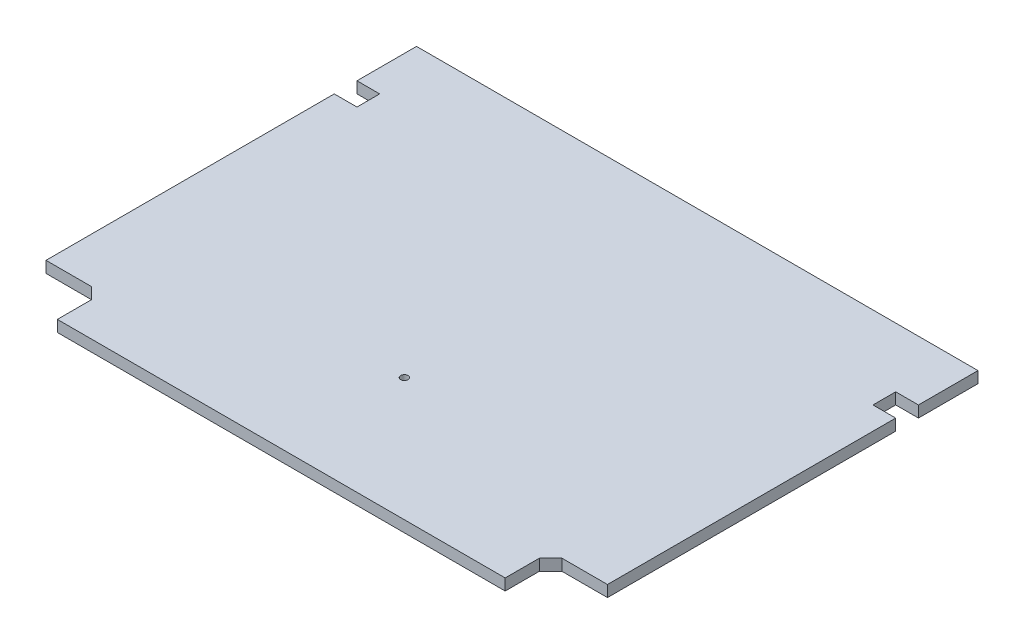
ISO-10303-21;
HEADER;
FILE_DESCRIPTION(('STEP AP214'),'2;1');
FILE_NAME('part.step','',(''),(''),'','','');
FILE_SCHEMA(('AUTOMOTIVE_DESIGN { 1 0 10303 214 1 1 1 1 }'));
ENDSEC;
DATA;
#1=APPLICATION_CONTEXT('core data for automotive mechanical design processes');
#2=APPLICATION_PROTOCOL_DEFINITION('international standard','automotive_design',2000,#1);
#3=PRODUCT_CONTEXT('',#1,'mechanical');
#4=PRODUCT('Part','Part','',(#3));
#5=PRODUCT_RELATED_PRODUCT_CATEGORY('part','',(#4));
#6=PRODUCT_DEFINITION_FORMATION('','',#4);
#7=PRODUCT_DEFINITION_CONTEXT('part definition',#1,'design');
#8=PRODUCT_DEFINITION('design','',#6,#7);
#9=PRODUCT_DEFINITION_SHAPE('','',#8);
#10=(LENGTH_UNIT() NAMED_UNIT(*) SI_UNIT(.MILLI.,.METRE.));
#11=(NAMED_UNIT(*) PLANE_ANGLE_UNIT() SI_UNIT($,.RADIAN.));
#12=(NAMED_UNIT(*) SI_UNIT($,.STERADIAN.) SOLID_ANGLE_UNIT());
#13=UNCERTAINTY_MEASURE_WITH_UNIT(LENGTH_MEASURE(1.E-05),#10,'distance_accuracy_value','');
#14=(GEOMETRIC_REPRESENTATION_CONTEXT(3) GLOBAL_UNCERTAINTY_ASSIGNED_CONTEXT((#13)) GLOBAL_UNIT_ASSIGNED_CONTEXT((#10,
#11,#12)) REPRESENTATION_CONTEXT('',''));
#15=CARTESIAN_POINT('',(0.,0.,0.));
#16=DIRECTION('',(0.,0.,1.));
#17=DIRECTION('',(1.,0.,0.));
#18=AXIS2_PLACEMENT_3D('',#15,#16,#17);
#19=CARTESIAN_POINT('',(0.,5.,0.));
#20=DIRECTION('',(0.,-1.,0.));
#21=DIRECTION('',(0.,0.,-1.));
#22=AXIS2_PLACEMENT_3D('',#19,#20,#21);
#23=PLANE('',#22);
#24=DIRECTION('',(0.,0.,-1.));
#25=VECTOR('',#24,1.);
#26=CARTESIAN_POINT('',(123.5,5.,21.2000000000035));
#27=LINE('',#26,#25);
#28=CARTESIAN_POINT('',(123.5,5.,21.2000000000035));
#29=VERTEX_POINT('',#28);
#30=CARTESIAN_POINT('',(123.5,5.,-4.99999999999998));
#31=VERTEX_POINT('',#30);
#32=EDGE_CURVE('E225',#29,#31,#27,.T.);
#33=ORIENTED_EDGE('',*,*,#32,.T.);
#34=DIRECTION('',(-1.,0.,0.));
#35=VECTOR('',#34,1.);
#36=CARTESIAN_POINT('',(-123.5,5.,-4.99999999999999));
#37=LINE('',#36,#35);
#38=CARTESIAN_POINT('',(-123.5,5.,-4.99999999999999));
#39=VERTEX_POINT('',#38);
#40=EDGE_CURVE('E123',#31,#39,#37,.T.);
#41=ORIENTED_EDGE('',*,*,#40,.T.);
#42=DIRECTION('',(0.,0.,1.));
#43=VECTOR('',#42,1.);
#44=CARTESIAN_POINT('',(-123.5,5.,21.2));
#45=LINE('',#44,#43);
#46=CARTESIAN_POINT('',(-123.5,5.,21.2));
#47=VERTEX_POINT('',#46);
#48=EDGE_CURVE('E270',#39,#47,#45,.T.);
#49=ORIENTED_EDGE('',*,*,#48,.T.);
#50=DIRECTION('',(1.,0.,0.));
#51=VECTOR('',#50,1.);
#52=CARTESIAN_POINT('',(-113.5,5.,21.2));
#53=LINE('',#52,#51);
#54=CARTESIAN_POINT('',(-113.5,5.,21.2));
#55=VERTEX_POINT('',#54);
#56=EDGE_CURVE('E289',#47,#55,#53,.T.);
#57=ORIENTED_EDGE('',*,*,#56,.T.);
#58=DIRECTION('',(0.,0.,1.));
#59=VECTOR('',#58,1.);
#60=CARTESIAN_POINT('',(-113.5,5.,31.2));
#61=LINE('',#60,#59);
#62=CARTESIAN_POINT('',(-113.5,5.,31.2));
#63=VERTEX_POINT('',#62);
#64=EDGE_CURVE('E286',#55,#63,#61,.T.);
#65=ORIENTED_EDGE('',*,*,#64,.T.);
#66=DIRECTION('',(-1.,0.,0.));
#67=VECTOR('',#66,1.);
#68=CARTESIAN_POINT('',(-123.5,5.,31.2));
#69=LINE('',#68,#67);
#70=CARTESIAN_POINT('',(-123.5,5.,31.2));
#71=VERTEX_POINT('',#70);
#72=EDGE_CURVE('E288',#63,#71,#69,.T.);
#73=ORIENTED_EDGE('',*,*,#72,.T.);
#74=DIRECTION('',(0.,0.,1.));
#75=VECTOR('',#74,1.);
#76=CARTESIAN_POINT('',(-123.5,5.,31.2));
#77=LINE('',#76,#75);
#78=CARTESIAN_POINT('',(-123.5,5.,158.));
#79=VERTEX_POINT('',#78);
#80=EDGE_CURVE('E291',#71,#79,#77,.T.);
#81=ORIENTED_EDGE('',*,*,#80,.T.);
#82=DIRECTION('',(1.,0.,0.));
#83=VECTOR('',#82,1.);
#84=CARTESIAN_POINT('',(-123.5,5.,158.));
#85=LINE('',#84,#83);
#86=CARTESIAN_POINT('',(-103.5,5.,158.));
#87=VERTEX_POINT('',#86);
#88=EDGE_CURVE('E297',#79,#87,#85,.T.);
#89=ORIENTED_EDGE('',*,*,#88,.T.);
#90=DIRECTION('',(0.707106781186547,0.,0.707106781186547));
#91=VECTOR('',#90,1.);
#92=CARTESIAN_POINT('',(-103.5,5.,158.));
#93=LINE('',#92,#91);
#94=CARTESIAN_POINT('',(-98.5,5.,163.));
#95=VERTEX_POINT('',#94);
#96=EDGE_CURVE('E299',#87,#95,#93,.T.);
#97=ORIENTED_EDGE('',*,*,#96,.T.);
#98=DIRECTION('',(0.,0.,1.));
#99=VECTOR('',#98,1.);
#100=CARTESIAN_POINT('',(-98.5,5.,163.));
#101=LINE('',#100,#99);
#102=CARTESIAN_POINT('',(-98.5,5.,178.));
#103=VERTEX_POINT('',#102);
#104=EDGE_CURVE('E301',#95,#103,#101,.T.);
#105=ORIENTED_EDGE('',*,*,#104,.T.);
#106=DIRECTION('',(1.,0.,0.));
#107=VECTOR('',#106,1.);
#108=CARTESIAN_POINT('',(-98.5,5.,178.));
#109=LINE('',#108,#107);
#110=CARTESIAN_POINT('',(98.5,5.,178.));
#111=VERTEX_POINT('',#110);
#112=EDGE_CURVE('E303',#103,#111,#109,.T.);
#113=ORIENTED_EDGE('',*,*,#112,.T.);
#114=DIRECTION('',(0.,0.,-1.));
#115=VECTOR('',#114,1.);
#116=CARTESIAN_POINT('',(98.5,5.,178.));
#117=LINE('',#116,#115);
#118=CARTESIAN_POINT('',(98.5,5.,163.));
#119=VERTEX_POINT('',#118);
#120=EDGE_CURVE('E305',#111,#119,#117,.T.);
#121=ORIENTED_EDGE('',*,*,#120,.T.);
#122=DIRECTION('',(0.707106781186547,0.,-0.707106781186547));
#123=VECTOR('',#122,1.);
#124=CARTESIAN_POINT('',(98.5,5.,163.));
#125=LINE('',#124,#123);
#126=CARTESIAN_POINT('',(103.5,5.,158.));
#127=VERTEX_POINT('',#126);
#128=EDGE_CURVE('E307',#119,#127,#125,.T.);
#129=ORIENTED_EDGE('',*,*,#128,.T.);
#130=DIRECTION('',(1.,0.,0.));
#131=VECTOR('',#130,1.);
#132=CARTESIAN_POINT('',(103.5,5.,158.));
#133=LINE('',#132,#131);
#134=CARTESIAN_POINT('',(123.5,5.,158.));
#135=VERTEX_POINT('',#134);
#136=EDGE_CURVE('E309',#127,#135,#133,.T.);
#137=ORIENTED_EDGE('',*,*,#136,.T.);
#138=DIRECTION('',(0.,0.,-1.));
#139=VECTOR('',#138,1.);
#140=CARTESIAN_POINT('',(123.5,5.,31.2000000000035));
#141=LINE('',#140,#139);
#142=CARTESIAN_POINT('',(123.5,5.,31.2000000000035));
#143=VERTEX_POINT('',#142);
#144=EDGE_CURVE('E172',#135,#143,#141,.T.);
#145=ORIENTED_EDGE('',*,*,#144,.T.);
#146=DIRECTION('',(-1.,0.,0.));
#147=VECTOR('',#146,1.);
#148=CARTESIAN_POINT('',(123.5,5.,31.2000000000035));
#149=LINE('',#148,#147);
#150=CARTESIAN_POINT('',(113.5,5.,31.2000000000035));
#151=VERTEX_POINT('',#150);
#152=EDGE_CURVE('E166',#143,#151,#149,.T.);
#153=ORIENTED_EDGE('',*,*,#152,.T.);
#154=DIRECTION('',(0.,0.,-1.));
#155=VECTOR('',#154,1.);
#156=CARTESIAN_POINT('',(113.5,5.,31.2000000000035));
#157=LINE('',#156,#155);
#158=CARTESIAN_POINT('',(113.5,5.,21.2000000000035));
#159=VERTEX_POINT('',#158);
#160=EDGE_CURVE('E170',#151,#159,#157,.T.);
#161=ORIENTED_EDGE('',*,*,#160,.T.);
#162=DIRECTION('',(1.,0.,0.));
#163=VECTOR('',#162,1.);
#164=CARTESIAN_POINT('',(113.5,5.,21.2000000000035));
#165=LINE('',#164,#163);
#166=EDGE_CURVE('E50',#159,#29,#165,.T.);
#167=ORIENTED_EDGE('',*,*,#166,.T.);
#168=EDGE_LOOP('',(#33,#41,#49,#57,#65,#73,#81,#89,#97,#105,#113,#121,#129,#137,#145,#153,#161,#167));
#169=FACE_BOUND('',#168,.T.);
#170=CARTESIAN_POINT('',(0.,5.,123.86));
#171=DIRECTION('',(0.,1.,0.));
#172=DIRECTION('',(0.,0.,1.));
#173=AXIS2_PLACEMENT_3D('',#170,#171,#172);
#174=CIRCLE('',#173,1.6);
#175=CARTESIAN_POINT('',(0.,5.,125.46));
#176=VERTEX_POINT('',#175);
#177=EDGE_CURVE('E194',#176,#176,#174,.T.);
#178=ORIENTED_EDGE('',*,*,#177,.F.);
#179=EDGE_LOOP('',(#178));
#180=FACE_BOUND('',#179,.T.);
#181=ADVANCED_FACE('F33',(#169,#180),#23,.F.);
#182=CARTESIAN_POINT('',(0.,0.,0.));
#183=DIRECTION('',(0.,-1.,0.));
#184=DIRECTION('',(0.,0.,-1.));
#185=AXIS2_PLACEMENT_3D('',#182,#183,#184);
#186=PLANE('',#185);
#187=DIRECTION('',(0.,0.,-1.));
#188=VECTOR('',#187,1.);
#189=CARTESIAN_POINT('',(123.5,0.,21.2000000000035));
#190=LINE('',#189,#188);
#191=CARTESIAN_POINT('',(123.5,0.,21.2000000000035));
#192=VERTEX_POINT('',#191);
#193=CARTESIAN_POINT('',(123.5,0.,-4.99999999999998));
#194=VERTEX_POINT('',#193);
#195=EDGE_CURVE('E190',#192,#194,#190,.T.);
#196=ORIENTED_EDGE('',*,*,#195,.F.);
#197=DIRECTION('',(1.,0.,0.));
#198=VECTOR('',#197,1.);
#199=CARTESIAN_POINT('',(113.5,0.,21.2000000000035));
#200=LINE('',#199,#198);
#201=CARTESIAN_POINT('',(113.5,0.,21.2000000000035));
#202=VERTEX_POINT('',#201);
#203=EDGE_CURVE('E115',#202,#192,#200,.T.);
#204=ORIENTED_EDGE('',*,*,#203,.F.);
#205=DIRECTION('',(0.,0.,-1.));
#206=VECTOR('',#205,1.);
#207=CARTESIAN_POINT('',(113.5,0.,31.2000000000035));
#208=LINE('',#207,#206);
#209=CARTESIAN_POINT('',(113.5,0.,31.2000000000035));
#210=VERTEX_POINT('',#209);
#211=EDGE_CURVE('E109',#210,#202,#208,.T.);
#212=ORIENTED_EDGE('',*,*,#211,.F.);
#213=DIRECTION('',(-1.,0.,0.));
#214=VECTOR('',#213,1.);
#215=CARTESIAN_POINT('',(123.5,0.,31.2000000000035));
#216=LINE('',#215,#214);
#217=CARTESIAN_POINT('',(123.5,0.,31.2000000000035));
#218=VERTEX_POINT('',#217);
#219=EDGE_CURVE('E180',#218,#210,#216,.T.);
#220=ORIENTED_EDGE('',*,*,#219,.F.);
#221=DIRECTION('',(0.,0.,-1.));
#222=VECTOR('',#221,1.);
#223=CARTESIAN_POINT('',(123.5,0.,31.2000000000035));
#224=LINE('',#223,#222);
#225=CARTESIAN_POINT('',(123.5,0.,158.));
#226=VERTEX_POINT('',#225);
#227=EDGE_CURVE('E220',#226,#218,#224,.T.);
#228=ORIENTED_EDGE('',*,*,#227,.F.);
#229=DIRECTION('',(1.,0.,0.));
#230=VECTOR('',#229,1.);
#231=CARTESIAN_POINT('',(103.5,0.,158.));
#232=LINE('',#231,#230);
#233=CARTESIAN_POINT('',(103.5,0.,158.));
#234=VERTEX_POINT('',#233);
#235=EDGE_CURVE('E218',#234,#226,#232,.T.);
#236=ORIENTED_EDGE('',*,*,#235,.F.);
#237=DIRECTION('',(0.707106781186547,0.,-0.707106781186547));
#238=VECTOR('',#237,1.);
#239=CARTESIAN_POINT('',(98.5,0.,163.));
#240=LINE('',#239,#238);
#241=CARTESIAN_POINT('',(98.5,0.,163.));
#242=VERTEX_POINT('',#241);
#243=EDGE_CURVE('E216',#242,#234,#240,.T.);
#244=ORIENTED_EDGE('',*,*,#243,.F.);
#245=DIRECTION('',(0.,0.,-1.));
#246=VECTOR('',#245,1.);
#247=CARTESIAN_POINT('',(98.5,0.,178.));
#248=LINE('',#247,#246);
#249=CARTESIAN_POINT('',(98.5,0.,178.));
#250=VERTEX_POINT('',#249);
#251=EDGE_CURVE('E214',#250,#242,#248,.T.);
#252=ORIENTED_EDGE('',*,*,#251,.F.);
#253=DIRECTION('',(1.,0.,0.));
#254=VECTOR('',#253,1.);
#255=CARTESIAN_POINT('',(-98.5,0.,178.));
#256=LINE('',#255,#254);
#257=CARTESIAN_POINT('',(-98.5,0.,178.));
#258=VERTEX_POINT('',#257);
#259=EDGE_CURVE('E212',#258,#250,#256,.T.);
#260=ORIENTED_EDGE('',*,*,#259,.F.);
#261=DIRECTION('',(0.,0.,1.));
#262=VECTOR('',#261,1.);
#263=CARTESIAN_POINT('',(-98.5,0.,163.));
#264=LINE('',#263,#262);
#265=CARTESIAN_POINT('',(-98.5,0.,163.));
#266=VERTEX_POINT('',#265);
#267=EDGE_CURVE('E210',#266,#258,#264,.T.);
#268=ORIENTED_EDGE('',*,*,#267,.F.);
#269=DIRECTION('',(0.707106781186547,0.,0.707106781186547));
#270=VECTOR('',#269,1.);
#271=CARTESIAN_POINT('',(-103.5,0.,158.));
#272=LINE('',#271,#270);
#273=CARTESIAN_POINT('',(-103.5,0.,158.));
#274=VERTEX_POINT('',#273);
#275=EDGE_CURVE('E208',#274,#266,#272,.T.);
#276=ORIENTED_EDGE('',*,*,#275,.F.);
#277=DIRECTION('',(1.,0.,0.));
#278=VECTOR('',#277,1.);
#279=CARTESIAN_POINT('',(-123.5,0.,158.));
#280=LINE('',#279,#278);
#281=CARTESIAN_POINT('',(-123.5,0.,158.));
#282=VERTEX_POINT('',#281);
#283=EDGE_CURVE('E206',#282,#274,#280,.T.);
#284=ORIENTED_EDGE('',*,*,#283,.F.);
#285=DIRECTION('',(0.,0.,1.));
#286=VECTOR('',#285,1.);
#287=CARTESIAN_POINT('',(-123.5,0.,31.2));
#288=LINE('',#287,#286);
#289=CARTESIAN_POINT('',(-123.5,0.,31.2));
#290=VERTEX_POINT('',#289);
#291=EDGE_CURVE('E204',#290,#282,#288,.T.);
#292=ORIENTED_EDGE('',*,*,#291,.F.);
#293=DIRECTION('',(-1.,0.,0.));
#294=VECTOR('',#293,1.);
#295=CARTESIAN_POINT('',(-123.5,0.,31.2));
#296=LINE('',#295,#294);
#297=CARTESIAN_POINT('',(-113.5,0.,31.2));
#298=VERTEX_POINT('',#297);
#299=EDGE_CURVE('E202',#298,#290,#296,.T.);
#300=ORIENTED_EDGE('',*,*,#299,.F.);
#301=DIRECTION('',(0.,0.,1.));
#302=VECTOR('',#301,1.);
#303=CARTESIAN_POINT('',(-113.5,0.,31.2));
#304=LINE('',#303,#302);
#305=CARTESIAN_POINT('',(-113.5,0.,21.2));
#306=VERTEX_POINT('',#305);
#307=EDGE_CURVE('E200',#306,#298,#304,.T.);
#308=ORIENTED_EDGE('',*,*,#307,.F.);
#309=DIRECTION('',(1.,0.,0.));
#310=VECTOR('',#309,1.);
#311=CARTESIAN_POINT('',(-113.5,0.,21.2));
#312=LINE('',#311,#310);
#313=CARTESIAN_POINT('',(-123.5,0.,21.2));
#314=VERTEX_POINT('',#313);
#315=EDGE_CURVE('E198',#314,#306,#312,.T.);
#316=ORIENTED_EDGE('',*,*,#315,.F.);
#317=DIRECTION('',(0.,0.,1.));
#318=VECTOR('',#317,1.);
#319=CARTESIAN_POINT('',(-123.5,0.,21.2));
#320=LINE('',#319,#318);
#321=CARTESIAN_POINT('',(-123.5,0.,-4.99999999999999));
#322=VERTEX_POINT('',#321);
#323=EDGE_CURVE('E196',#322,#314,#320,.T.);
#324=ORIENTED_EDGE('',*,*,#323,.F.);
#325=DIRECTION('',(-1.,0.,0.));
#326=VECTOR('',#325,1.);
#327=CARTESIAN_POINT('',(-123.5,0.,-4.99999999999999));
#328=LINE('',#327,#326);
#329=EDGE_CURVE('E193',#194,#322,#328,.T.);
#330=ORIENTED_EDGE('',*,*,#329,.F.);
#331=EDGE_LOOP('',(#196,#204,#212,#220,#228,#236,#244,#252,#260,#268,#276,#284,#292,#300,#308,
#316,#324,#330));
#332=FACE_BOUND('',#331,.T.);
#333=CARTESIAN_POINT('',(0.,0.,123.86));
#334=DIRECTION('',(0.,1.,0.));
#335=DIRECTION('',(0.,0.,1.));
#336=AXIS2_PLACEMENT_3D('',#333,#334,#335);
#337=CIRCLE('',#336,1.6);
#338=CARTESIAN_POINT('',(0.,0.,125.46));
#339=VERTEX_POINT('',#338);
#340=EDGE_CURVE('E534',#339,#339,#337,.T.);
#341=ORIENTED_EDGE('',*,*,#340,.T.);
#342=EDGE_LOOP('',(#341));
#343=FACE_BOUND('',#342,.T.);
#344=ADVANCED_FACE('F274',(#332,#343),#186,.T.);
#345=CARTESIAN_POINT('',(123.5,5.,21.2000000000035));
#346=DIRECTION('',(-1.,0.,0.));
#347=DIRECTION('',(0.,0.,1.));
#348=AXIS2_PLACEMENT_3D('',#345,#346,#347);
#349=PLANE('',#348);
#350=ORIENTED_EDGE('',*,*,#195,.T.);
#351=DIRECTION('',(0.,-1.,0.));
#352=VECTOR('',#351,1.);
#353=CARTESIAN_POINT('',(123.5,5.,-4.99999999999998));
#354=LINE('',#353,#352);
#355=EDGE_CURVE('E11',#31,#194,#354,.T.);
#356=ORIENTED_EDGE('',*,*,#355,.F.);
#357=ORIENTED_EDGE('',*,*,#32,.F.);
#358=DIRECTION('',(0.,-1.,0.));
#359=VECTOR('',#358,1.);
#360=CARTESIAN_POINT('',(123.5,5.,21.2000000000035));
#361=LINE('',#360,#359);
#362=EDGE_CURVE('E186',#29,#192,#361,.T.);
#363=ORIENTED_EDGE('',*,*,#362,.T.);
#364=EDGE_LOOP('',(#350,#356,#357,#363));
#365=FACE_BOUND('',#364,.T.);
#366=ADVANCED_FACE('F35',(#365),#349,.F.);
#367=CARTESIAN_POINT('',(-123.5,5.,-4.99999999999999));
#368=DIRECTION('',(0.,0.,1.));
#369=DIRECTION('',(1.,0.,0.));
#370=AXIS2_PLACEMENT_3D('',#367,#368,#369);
#371=PLANE('',#370);
#372=ORIENTED_EDGE('',*,*,#329,.T.);
#373=DIRECTION('',(0.,-1.,0.));
#374=VECTOR('',#373,1.);
#375=CARTESIAN_POINT('',(-123.5,5.,-4.99999999999999));
#376=LINE('',#375,#374);
#377=EDGE_CURVE('E42',#39,#322,#376,.T.);
#378=ORIENTED_EDGE('',*,*,#377,.F.);
#379=ORIENTED_EDGE('',*,*,#40,.F.);
#380=ORIENTED_EDGE('',*,*,#355,.T.);
#381=EDGE_LOOP('',(#372,#378,#379,#380));
#382=FACE_BOUND('',#381,.T.);
#383=ADVANCED_FACE('F343',(#382),#371,.F.);
#384=CARTESIAN_POINT('',(-123.5,5.,21.2));
#385=DIRECTION('',(1.,0.,0.));
#386=DIRECTION('',(0.,0.,-1.));
#387=AXIS2_PLACEMENT_3D('',#384,#385,#386);
#388=PLANE('',#387);
#389=ORIENTED_EDGE('',*,*,#323,.T.);
#390=DIRECTION('',(0.,-1.,0.));
#391=VECTOR('',#390,1.);
#392=CARTESIAN_POINT('',(-123.5,5.,21.2));
#393=LINE('',#392,#391);
#394=EDGE_CURVE('E262',#47,#314,#393,.T.);
#395=ORIENTED_EDGE('',*,*,#394,.F.);
#396=ORIENTED_EDGE('',*,*,#48,.F.);
#397=ORIENTED_EDGE('',*,*,#377,.T.);
#398=EDGE_LOOP('',(#389,#395,#396,#397));
#399=FACE_BOUND('',#398,.T.);
#400=ADVANCED_FACE('F268',(#399),#388,.F.);
#401=CARTESIAN_POINT('',(-113.5,5.,21.2));
#402=DIRECTION('',(0.,0.,-1.));
#403=DIRECTION('',(-1.,0.,0.));
#404=AXIS2_PLACEMENT_3D('',#401,#402,#403);
#405=PLANE('',#404);
#406=ORIENTED_EDGE('',*,*,#315,.T.);
#407=DIRECTION('',(0.,-1.,0.));
#408=VECTOR('',#407,1.);
#409=CARTESIAN_POINT('',(-113.5,5.,21.2));
#410=LINE('',#409,#408);
#411=EDGE_CURVE('E259',#55,#306,#410,.T.);
#412=ORIENTED_EDGE('',*,*,#411,.F.);
#413=ORIENTED_EDGE('',*,*,#56,.F.);
#414=ORIENTED_EDGE('',*,*,#394,.T.);
#415=EDGE_LOOP('',(#406,#412,#413,#414));
#416=FACE_BOUND('',#415,.T.);
#417=ADVANCED_FACE('F280',(#416),#405,.F.);
#418=CARTESIAN_POINT('',(-113.5,5.,31.2));
#419=DIRECTION('',(1.,0.,0.));
#420=DIRECTION('',(0.,0.,-1.));
#421=AXIS2_PLACEMENT_3D('',#418,#419,#420);
#422=PLANE('',#421);
#423=ORIENTED_EDGE('',*,*,#307,.T.);
#424=DIRECTION('',(0.,-1.,0.));
#425=VECTOR('',#424,1.);
#426=CARTESIAN_POINT('',(-113.5,5.,31.2));
#427=LINE('',#426,#425);
#428=EDGE_CURVE('E256',#63,#298,#427,.T.);
#429=ORIENTED_EDGE('',*,*,#428,.F.);
#430=ORIENTED_EDGE('',*,*,#64,.F.);
#431=ORIENTED_EDGE('',*,*,#411,.T.);
#432=EDGE_LOOP('',(#423,#429,#430,#431));
#433=FACE_BOUND('',#432,.T.);
#434=ADVANCED_FACE('F284',(#433),#422,.F.);
#435=CARTESIAN_POINT('',(-123.5,5.,31.2));
#436=DIRECTION('',(0.,0.,1.));
#437=DIRECTION('',(1.,0.,0.));
#438=AXIS2_PLACEMENT_3D('',#435,#436,#437);
#439=PLANE('',#438);
#440=ORIENTED_EDGE('',*,*,#299,.T.);
#441=DIRECTION('',(0.,-1.,0.));
#442=VECTOR('',#441,1.);
#443=CARTESIAN_POINT('',(-123.5,5.,31.2));
#444=LINE('',#443,#442);
#445=EDGE_CURVE('E253',#71,#290,#444,.T.);
#446=ORIENTED_EDGE('',*,*,#445,.F.);
#447=ORIENTED_EDGE('',*,*,#72,.F.);
#448=ORIENTED_EDGE('',*,*,#428,.T.);
#449=EDGE_LOOP('',(#440,#446,#447,#448));
#450=FACE_BOUND('',#449,.T.);
#451=ADVANCED_FACE('F356',(#450),#439,.F.);
#452=CARTESIAN_POINT('',(-123.5,5.,31.2));
#453=DIRECTION('',(1.,0.,0.));
#454=DIRECTION('',(0.,0.,-1.));
#455=AXIS2_PLACEMENT_3D('',#452,#453,#454);
#456=PLANE('',#455);
#457=ORIENTED_EDGE('',*,*,#291,.T.);
#458=DIRECTION('',(0.,-1.,0.));
#459=VECTOR('',#458,1.);
#460=CARTESIAN_POINT('',(-123.5,5.,158.));
#461=LINE('',#460,#459);
#462=EDGE_CURVE('E250',#79,#282,#461,.T.);
#463=ORIENTED_EDGE('',*,*,#462,.F.);
#464=ORIENTED_EDGE('',*,*,#80,.F.);
#465=ORIENTED_EDGE('',*,*,#445,.T.);
#466=EDGE_LOOP('',(#457,#463,#464,#465));
#467=FACE_BOUND('',#466,.T.);
#468=ADVANCED_FACE('F359',(#467),#456,.F.);
#469=CARTESIAN_POINT('',(-123.5,5.,158.));
#470=DIRECTION('',(0.,0.,-1.));
#471=DIRECTION('',(-1.,0.,0.));
#472=AXIS2_PLACEMENT_3D('',#469,#470,#471);
#473=PLANE('',#472);
#474=ORIENTED_EDGE('',*,*,#283,.T.);
#475=DIRECTION('',(0.,-1.,0.));
#476=VECTOR('',#475,1.);
#477=CARTESIAN_POINT('',(-103.5,5.,158.));
#478=LINE('',#477,#476);
#479=EDGE_CURVE('E247',#87,#274,#478,.T.);
#480=ORIENTED_EDGE('',*,*,#479,.F.);
#481=ORIENTED_EDGE('',*,*,#88,.F.);
#482=ORIENTED_EDGE('',*,*,#462,.T.);
#483=EDGE_LOOP('',(#474,#480,#481,#482));
#484=FACE_BOUND('',#483,.T.);
#485=ADVANCED_FACE('F363',(#484),#473,.F.);
#486=CARTESIAN_POINT('',(-103.5,5.,158.));
#487=DIRECTION('',(0.707106781186548,0.,-0.707106781186548));
#488=DIRECTION('',(-0.707106781186548,0.,-0.707106781186548));
#489=AXIS2_PLACEMENT_3D('',#486,#487,#488);
#490=PLANE('',#489);
#491=ORIENTED_EDGE('',*,*,#275,.T.);
#492=DIRECTION('',(0.,-1.,0.));
#493=VECTOR('',#492,1.);
#494=CARTESIAN_POINT('',(-98.5,5.,163.));
#495=LINE('',#494,#493);
#496=EDGE_CURVE('E244',#95,#266,#495,.T.);
#497=ORIENTED_EDGE('',*,*,#496,.F.);
#498=ORIENTED_EDGE('',*,*,#96,.F.);
#499=ORIENTED_EDGE('',*,*,#479,.T.);
#500=EDGE_LOOP('',(#491,#497,#498,#499));
#501=FACE_BOUND('',#500,.T.);
#502=ADVANCED_FACE('F367',(#501),#490,.F.);
#503=CARTESIAN_POINT('',(-98.5,5.,163.));
#504=DIRECTION('',(1.,0.,0.));
#505=DIRECTION('',(0.,0.,-1.));
#506=AXIS2_PLACEMENT_3D('',#503,#504,#505);
#507=PLANE('',#506);
#508=ORIENTED_EDGE('',*,*,#267,.T.);
#509=DIRECTION('',(0.,-1.,0.));
#510=VECTOR('',#509,1.);
#511=CARTESIAN_POINT('',(-98.5,5.,178.));
#512=LINE('',#511,#510);
#513=EDGE_CURVE('E241',#103,#258,#512,.T.);
#514=ORIENTED_EDGE('',*,*,#513,.F.);
#515=ORIENTED_EDGE('',*,*,#104,.F.);
#516=ORIENTED_EDGE('',*,*,#496,.T.);
#517=EDGE_LOOP('',(#508,#514,#515,#516));
#518=FACE_BOUND('',#517,.T.);
#519=ADVANCED_FACE('F371',(#518),#507,.F.);
#520=CARTESIAN_POINT('',(-98.5,5.,178.));
#521=DIRECTION('',(0.,0.,-1.));
#522=DIRECTION('',(-1.,0.,0.));
#523=AXIS2_PLACEMENT_3D('',#520,#521,#522);
#524=PLANE('',#523);
#525=ORIENTED_EDGE('',*,*,#259,.T.);
#526=DIRECTION('',(0.,-1.,0.));
#527=VECTOR('',#526,1.);
#528=CARTESIAN_POINT('',(98.5,5.,178.));
#529=LINE('',#528,#527);
#530=EDGE_CURVE('E238',#111,#250,#529,.T.);
#531=ORIENTED_EDGE('',*,*,#530,.F.);
#532=ORIENTED_EDGE('',*,*,#112,.F.);
#533=ORIENTED_EDGE('',*,*,#513,.T.);
#534=EDGE_LOOP('',(#525,#531,#532,#533));
#535=FACE_BOUND('',#534,.T.);
#536=ADVANCED_FACE('F375',(#535),#524,.F.);
#537=CARTESIAN_POINT('',(98.5,5.,178.));
#538=DIRECTION('',(-1.,0.,0.));
#539=DIRECTION('',(0.,0.,1.));
#540=AXIS2_PLACEMENT_3D('',#537,#538,#539);
#541=PLANE('',#540);
#542=ORIENTED_EDGE('',*,*,#251,.T.);
#543=DIRECTION('',(0.,-1.,0.));
#544=VECTOR('',#543,1.);
#545=CARTESIAN_POINT('',(98.5,5.,163.));
#546=LINE('',#545,#544);
#547=EDGE_CURVE('E235',#119,#242,#546,.T.);
#548=ORIENTED_EDGE('',*,*,#547,.F.);
#549=ORIENTED_EDGE('',*,*,#120,.F.);
#550=ORIENTED_EDGE('',*,*,#530,.T.);
#551=EDGE_LOOP('',(#542,#548,#549,#550));
#552=FACE_BOUND('',#551,.T.);
#553=ADVANCED_FACE('F379',(#552),#541,.F.);
#554=CARTESIAN_POINT('',(98.5,5.,163.));
#555=DIRECTION('',(-0.707106781186548,0.,-0.707106781186548));
#556=DIRECTION('',(-0.707106781186548,0.,0.707106781186548));
#557=AXIS2_PLACEMENT_3D('',#554,#555,#556);
#558=PLANE('',#557);
#559=ORIENTED_EDGE('',*,*,#243,.T.);
#560=DIRECTION('',(0.,-1.,0.));
#561=VECTOR('',#560,1.);
#562=CARTESIAN_POINT('',(103.5,5.,158.));
#563=LINE('',#562,#561);
#564=EDGE_CURVE('E232',#127,#234,#563,.T.);
#565=ORIENTED_EDGE('',*,*,#564,.F.);
#566=ORIENTED_EDGE('',*,*,#128,.F.);
#567=ORIENTED_EDGE('',*,*,#547,.T.);
#568=EDGE_LOOP('',(#559,#565,#566,#567));
#569=FACE_BOUND('',#568,.T.);
#570=ADVANCED_FACE('F383',(#569),#558,.F.);
#571=CARTESIAN_POINT('',(103.5,5.,158.));
#572=DIRECTION('',(0.,0.,-1.));
#573=DIRECTION('',(-1.,0.,0.));
#574=AXIS2_PLACEMENT_3D('',#571,#572,#573);
#575=PLANE('',#574);
#576=ORIENTED_EDGE('',*,*,#235,.T.);
#577=DIRECTION('',(0.,-1.,0.));
#578=VECTOR('',#577,1.);
#579=CARTESIAN_POINT('',(123.5,5.,158.));
#580=LINE('',#579,#578);
#581=EDGE_CURVE('E229',#135,#226,#580,.T.);
#582=ORIENTED_EDGE('',*,*,#581,.F.);
#583=ORIENTED_EDGE('',*,*,#136,.F.);
#584=ORIENTED_EDGE('',*,*,#564,.T.);
#585=EDGE_LOOP('',(#576,#582,#583,#584));
#586=FACE_BOUND('',#585,.T.);
#587=ADVANCED_FACE('F315',(#586),#575,.F.);
#588=CARTESIAN_POINT('',(123.5,5.,31.2000000000035));
#589=DIRECTION('',(-1.,0.,0.));
#590=DIRECTION('',(0.,0.,1.));
#591=AXIS2_PLACEMENT_3D('',#588,#589,#590);
#592=PLANE('',#591);
#593=ORIENTED_EDGE('',*,*,#227,.T.);
#594=DIRECTION('',(0.,-1.,0.));
#595=VECTOR('',#594,1.);
#596=CARTESIAN_POINT('',(123.5,5.,31.2000000000035));
#597=LINE('',#596,#595);
#598=EDGE_CURVE('E181',#143,#218,#597,.T.);
#599=ORIENTED_EDGE('',*,*,#598,.F.);
#600=ORIENTED_EDGE('',*,*,#144,.F.);
#601=ORIENTED_EDGE('',*,*,#581,.T.);
#602=EDGE_LOOP('',(#593,#599,#600,#601));
#603=FACE_BOUND('',#602,.T.);
#604=ADVANCED_FACE('F319',(#603),#592,.F.);
#605=CARTESIAN_POINT('',(123.5,5.,31.2000000000035));
#606=DIRECTION('',(0.,0.,1.));
#607=DIRECTION('',(1.,0.,0.));
#608=AXIS2_PLACEMENT_3D('',#605,#606,#607);
#609=PLANE('',#608);
#610=ORIENTED_EDGE('',*,*,#219,.T.);
#611=DIRECTION('',(0.,-1.,0.));
#612=VECTOR('',#611,1.);
#613=CARTESIAN_POINT('',(113.5,5.,31.2000000000035));
#614=LINE('',#613,#612);
#615=EDGE_CURVE('E177',#151,#210,#614,.T.);
#616=ORIENTED_EDGE('',*,*,#615,.F.);
#617=ORIENTED_EDGE('',*,*,#152,.F.);
#618=ORIENTED_EDGE('',*,*,#598,.T.);
#619=EDGE_LOOP('',(#610,#616,#617,#618));
#620=FACE_BOUND('',#619,.T.);
#621=ADVANCED_FACE('F178',(#620),#609,.F.);
#622=CARTESIAN_POINT('',(113.5,5.,31.2000000000035));
#623=DIRECTION('',(-1.,0.,0.));
#624=DIRECTION('',(0.,0.,1.));
#625=AXIS2_PLACEMENT_3D('',#622,#623,#624);
#626=PLANE('',#625);
#627=ORIENTED_EDGE('',*,*,#211,.T.);
#628=DIRECTION('',(0.,-1.,0.));
#629=VECTOR('',#628,1.);
#630=CARTESIAN_POINT('',(113.5,5.,21.2000000000035));
#631=LINE('',#630,#629);
#632=EDGE_CURVE('E182',#159,#202,#631,.T.);
#633=ORIENTED_EDGE('',*,*,#632,.F.);
#634=ORIENTED_EDGE('',*,*,#160,.F.);
#635=ORIENTED_EDGE('',*,*,#615,.T.);
#636=EDGE_LOOP('',(#627,#633,#634,#635));
#637=FACE_BOUND('',#636,.T.);
#638=ADVANCED_FACE('F184',(#637),#626,.F.);
#639=CARTESIAN_POINT('',(113.5,5.,21.2000000000035));
#640=DIRECTION('',(0.,0.,-1.));
#641=DIRECTION('',(-1.,0.,0.));
#642=AXIS2_PLACEMENT_3D('',#639,#640,#641);
#643=PLANE('',#642);
#644=ORIENTED_EDGE('',*,*,#203,.T.);
#645=ORIENTED_EDGE('',*,*,#362,.F.);
#646=ORIENTED_EDGE('',*,*,#166,.F.);
#647=ORIENTED_EDGE('',*,*,#632,.T.);
#648=EDGE_LOOP('',(#644,#645,#646,#647));
#649=FACE_BOUND('',#648,.T.);
#650=ADVANCED_FACE('F323',(#649),#643,.F.);
#651=CARTESIAN_POINT('',(0.,5.,123.86));
#652=DIRECTION('',(0.,-1.,0.));
#653=DIRECTION('',(0.,0.,-1.));
#654=AXIS2_PLACEMENT_3D('',#651,#652,#653);
#655=CYLINDRICAL_SURFACE('',#654,1.6);
#656=ORIENTED_EDGE('',*,*,#177,.T.);
#657=EDGE_LOOP('',(#656));
#658=FACE_BOUND('',#657,.T.);
#659=ORIENTED_EDGE('',*,*,#340,.F.);
#660=EDGE_LOOP('',(#659));
#661=FACE_BOUND('',#660,.T.);
#662=ADVANCED_FACE('F325',(#658,#661),#655,.F.);
#663=CLOSED_SHELL('',(#181,#344,#366,#383,#400,#417,#434,#451,#468,#485,#502,#519,#536,#553,
#570,#587,#604,#621,#638,#650,#662));
#664=MANIFOLD_SOLID_BREP('B2',#663);
#665=ADVANCED_BREP_SHAPE_REPRESENTATION('',(#18,#664),#14);
#666=SHAPE_DEFINITION_REPRESENTATION(#9,#665);
ENDSEC;
END-ISO-10303-21;
